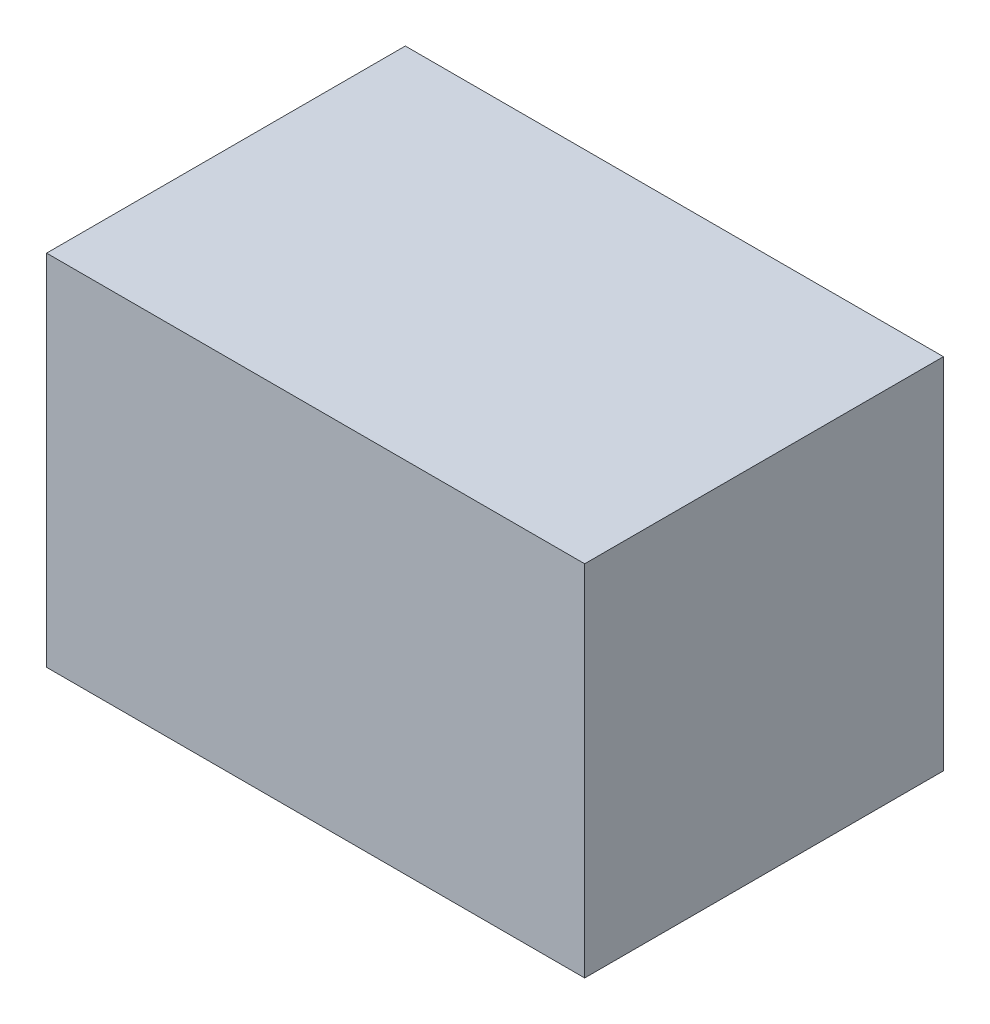
ISO-10303-21;
HEADER;
FILE_DESCRIPTION(('STEP AP214'),'2;1');
FILE_NAME('part.step','',(''),(''),'','','');
FILE_SCHEMA(('AUTOMOTIVE_DESIGN { 1 0 10303 214 1 1 1 1 }'));
ENDSEC;
DATA;
#1=APPLICATION_CONTEXT('core data for automotive mechanical design processes');
#2=APPLICATION_PROTOCOL_DEFINITION('international standard','automotive_design',2000,#1);
#3=PRODUCT_CONTEXT('',#1,'mechanical');
#4=PRODUCT('Part','Part','',(#3));
#5=PRODUCT_RELATED_PRODUCT_CATEGORY('part','',(#4));
#6=PRODUCT_DEFINITION_FORMATION('','',#4);
#7=PRODUCT_DEFINITION_CONTEXT('part definition',#1,'design');
#8=PRODUCT_DEFINITION('design','',#6,#7);
#9=PRODUCT_DEFINITION_SHAPE('','',#8);
#10=(LENGTH_UNIT() NAMED_UNIT(*) SI_UNIT(.MILLI.,.METRE.));
#11=(NAMED_UNIT(*) PLANE_ANGLE_UNIT() SI_UNIT($,.RADIAN.));
#12=(NAMED_UNIT(*) SI_UNIT($,.STERADIAN.) SOLID_ANGLE_UNIT());
#13=UNCERTAINTY_MEASURE_WITH_UNIT(LENGTH_MEASURE(1.E-05),#10,'distance_accuracy_value','');
#14=(GEOMETRIC_REPRESENTATION_CONTEXT(3) GLOBAL_UNCERTAINTY_ASSIGNED_CONTEXT((#13)) GLOBAL_UNIT_ASSIGNED_CONTEXT((#10,
#11,#12)) REPRESENTATION_CONTEXT('',''));
#15=CARTESIAN_POINT('',(0.,0.,0.));
#16=DIRECTION('',(0.,0.,1.));
#17=DIRECTION('',(1.,0.,0.));
#18=AXIS2_PLACEMENT_3D('',#15,#16,#17);
#19=CARTESIAN_POINT('',(0.,0.,100.));
#20=DIRECTION('',(1.,0.,0.));
#21=DIRECTION('',(0.,1.,0.));
#22=AXIS2_PLACEMENT_3D('',#19,#20,#21);
#23=PLANE('',#22);
#24=DIRECTION('',(0.,-1.,0.));
#25=VECTOR('',#24,1.);
#26=CARTESIAN_POINT('',(0.,0.,0.));
#27=LINE('',#26,#25);
#28=CARTESIAN_POINT('',(0.,0.,0.));
#29=VERTEX_POINT('',#28);
#30=CARTESIAN_POINT('',(0.,-100.,0.));
#31=VERTEX_POINT('',#30);
#32=EDGE_CURVE('E96',#29,#31,#27,.T.);
#33=ORIENTED_EDGE('',*,*,#32,.T.);
#34=DIRECTION('',(0.,0.,-1.));
#35=VECTOR('',#34,1.);
#36=CARTESIAN_POINT('',(0.,-100.,100.));
#37=LINE('',#36,#35);
#38=CARTESIAN_POINT('',(0.,-100.,100.));
#39=VERTEX_POINT('',#38);
#40=EDGE_CURVE('E11',#39,#31,#37,.T.);
#41=ORIENTED_EDGE('',*,*,#40,.F.);
#42=DIRECTION('',(0.,-1.,0.));
#43=VECTOR('',#42,1.);
#44=CARTESIAN_POINT('',(0.,0.,100.));
#45=LINE('',#44,#43);
#46=CARTESIAN_POINT('',(0.,0.,100.));
#47=VERTEX_POINT('',#46);
#48=EDGE_CURVE('E84',#47,#39,#45,.T.);
#49=ORIENTED_EDGE('',*,*,#48,.F.);
#50=DIRECTION('',(0.,0.,-1.));
#51=VECTOR('',#50,1.);
#52=CARTESIAN_POINT('',(0.,0.,100.));
#53=LINE('',#52,#51);
#54=EDGE_CURVE('E92',#47,#29,#53,.T.);
#55=ORIENTED_EDGE('',*,*,#54,.T.);
#56=EDGE_LOOP('',(#33,#41,#49,#55));
#57=FACE_BOUND('',#56,.T.);
#58=ADVANCED_FACE('F33',(#57),#23,.F.);
#59=CARTESIAN_POINT('',(0.,-100.,100.));
#60=DIRECTION('',(0.,1.,0.));
#61=DIRECTION('',(0.,0.,1.));
#62=AXIS2_PLACEMENT_3D('',#59,#60,#61);
#63=PLANE('',#62);
#64=DIRECTION('',(1.,0.,0.));
#65=VECTOR('',#64,1.);
#66=CARTESIAN_POINT('',(0.,-100.,0.));
#67=LINE('',#66,#65);
#68=CARTESIAN_POINT('',(150.,-100.,0.));
#69=VERTEX_POINT('',#68);
#70=EDGE_CURVE('E88',#31,#69,#67,.T.);
#71=ORIENTED_EDGE('',*,*,#70,.T.);
#72=DIRECTION('',(0.,0.,-1.));
#73=VECTOR('',#72,1.);
#74=CARTESIAN_POINT('',(150.,-100.,100.));
#75=LINE('',#74,#73);
#76=CARTESIAN_POINT('',(150.,-100.,100.));
#77=VERTEX_POINT('',#76);
#78=EDGE_CURVE('E41',#77,#69,#75,.T.);
#79=ORIENTED_EDGE('',*,*,#78,.F.);
#80=DIRECTION('',(1.,0.,0.));
#81=VECTOR('',#80,1.);
#82=CARTESIAN_POINT('',(0.,-100.,100.));
#83=LINE('',#82,#81);
#84=EDGE_CURVE('E79',#39,#77,#83,.T.);
#85=ORIENTED_EDGE('',*,*,#84,.F.);
#86=ORIENTED_EDGE('',*,*,#40,.T.);
#87=EDGE_LOOP('',(#71,#79,#85,#86));
#88=FACE_BOUND('',#87,.T.);
#89=ADVANCED_FACE('F87',(#88),#63,.F.);
#90=CARTESIAN_POINT('',(150.,0.,100.));
#91=DIRECTION('',(-1.,0.,0.));
#92=DIRECTION('',(0.,-1.,0.));
#93=AXIS2_PLACEMENT_3D('',#90,#91,#92);
#94=PLANE('',#93);
#95=DIRECTION('',(0.,1.,0.));
#96=VECTOR('',#95,1.);
#97=CARTESIAN_POINT('',(150.,0.,0.));
#98=LINE('',#97,#96);
#99=CARTESIAN_POINT('',(150.,0.,0.));
#100=VERTEX_POINT('',#99);
#101=EDGE_CURVE('E66',#69,#100,#98,.T.);
#102=ORIENTED_EDGE('',*,*,#101,.T.);
#103=DIRECTION('',(0.,0.,-1.));
#104=VECTOR('',#103,1.);
#105=CARTESIAN_POINT('',(150.,0.,100.));
#106=LINE('',#105,#104);
#107=CARTESIAN_POINT('',(150.,0.,100.));
#108=VERTEX_POINT('',#107);
#109=EDGE_CURVE('E89',#108,#100,#106,.T.);
#110=ORIENTED_EDGE('',*,*,#109,.F.);
#111=DIRECTION('',(0.,1.,0.));
#112=VECTOR('',#111,1.);
#113=CARTESIAN_POINT('',(150.,0.,100.));
#114=LINE('',#113,#112);
#115=EDGE_CURVE('E82',#77,#108,#114,.T.);
#116=ORIENTED_EDGE('',*,*,#115,.F.);
#117=ORIENTED_EDGE('',*,*,#78,.T.);
#118=EDGE_LOOP('',(#102,#110,#116,#117));
#119=FACE_BOUND('',#118,.T.);
#120=ADVANCED_FACE('F90',(#119),#94,.F.);
#121=CARTESIAN_POINT('',(0.,0.,100.));
#122=DIRECTION('',(0.,-1.,0.));
#123=DIRECTION('',(0.,0.,-1.));
#124=AXIS2_PLACEMENT_3D('',#121,#122,#123);
#125=PLANE('',#124);
#126=DIRECTION('',(-1.,0.,0.));
#127=VECTOR('',#126,1.);
#128=CARTESIAN_POINT('',(0.,0.,0.));
#129=LINE('',#128,#127);
#130=EDGE_CURVE('E72',#100,#29,#129,.T.);
#131=ORIENTED_EDGE('',*,*,#130,.T.);
#132=ORIENTED_EDGE('',*,*,#54,.F.);
#133=DIRECTION('',(-1.,0.,0.));
#134=VECTOR('',#133,1.);
#135=CARTESIAN_POINT('',(0.,0.,100.));
#136=LINE('',#135,#134);
#137=EDGE_CURVE('E49',#108,#47,#136,.T.);
#138=ORIENTED_EDGE('',*,*,#137,.F.);
#139=ORIENTED_EDGE('',*,*,#109,.T.);
#140=EDGE_LOOP('',(#131,#132,#138,#139));
#141=FACE_BOUND('',#140,.T.);
#142=ADVANCED_FACE('F103',(#141),#125,.F.);
#143=CARTESIAN_POINT('',(0.,0.,100.));
#144=DIRECTION('',(0.,0.,1.));
#145=DIRECTION('',(1.,0.,0.));
#146=AXIS2_PLACEMENT_3D('',#143,#144,#145);
#147=PLANE('',#146);
#148=ORIENTED_EDGE('',*,*,#48,.T.);
#149=ORIENTED_EDGE('',*,*,#84,.T.);
#150=ORIENTED_EDGE('',*,*,#115,.T.);
#151=ORIENTED_EDGE('',*,*,#137,.T.);
#152=EDGE_LOOP('',(#148,#149,#150,#151));
#153=FACE_BOUND('',#152,.T.);
#154=ADVANCED_FACE('F80',(#153),#147,.T.);
#155=CARTESIAN_POINT('',(0.,0.,0.));
#156=DIRECTION('',(0.,0.,1.));
#157=DIRECTION('',(1.,0.,0.));
#158=AXIS2_PLACEMENT_3D('',#155,#156,#157);
#159=PLANE('',#158);
#160=ORIENTED_EDGE('',*,*,#32,.F.);
#161=ORIENTED_EDGE('',*,*,#130,.F.);
#162=ORIENTED_EDGE('',*,*,#101,.F.);
#163=ORIENTED_EDGE('',*,*,#70,.F.);
#164=EDGE_LOOP('',(#160,#161,#162,#163));
#165=FACE_BOUND('',#164,.T.);
#166=ADVANCED_FACE('F106',(#165),#159,.F.);
#167=CLOSED_SHELL('',(#58,#89,#120,#142,#154,#166));
#168=MANIFOLD_SOLID_BREP('B2',#167);
#169=ADVANCED_BREP_SHAPE_REPRESENTATION('',(#18,#168),#14);
#170=SHAPE_DEFINITION_REPRESENTATION(#9,#169);
ENDSEC;
END-ISO-10303-21;
